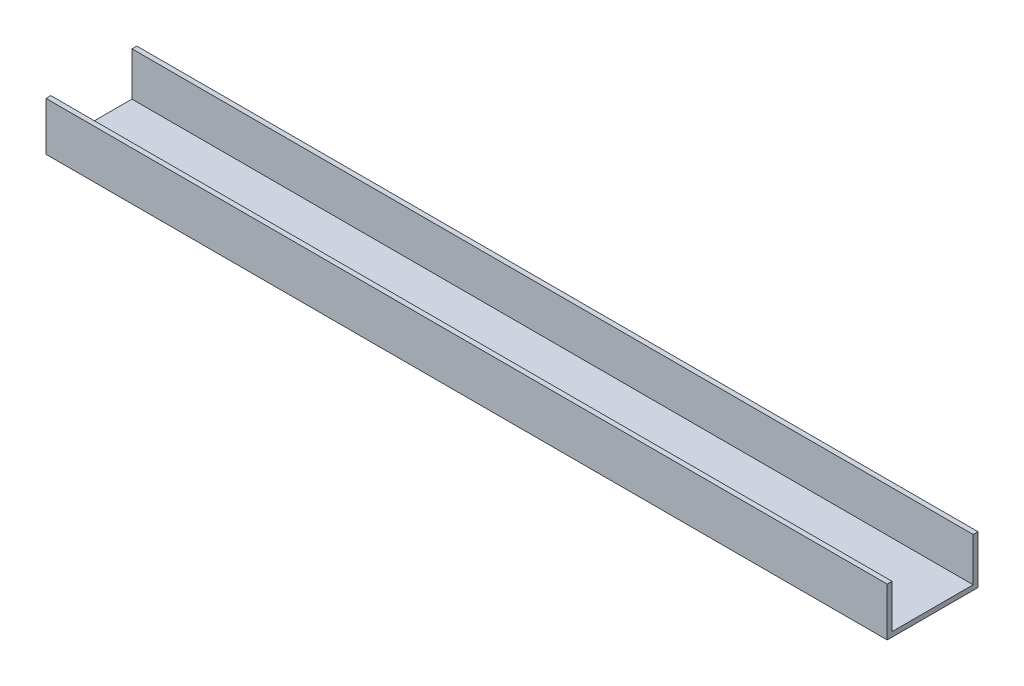
ISO-10303-21;
HEADER;
FILE_DESCRIPTION(('STEP AP214'),'2;1');
FILE_NAME('part.step','',(''),(''),'','','');
FILE_SCHEMA(('AUTOMOTIVE_DESIGN { 1 0 10303 214 1 1 1 1 }'));
ENDSEC;
DATA;
#1=APPLICATION_CONTEXT('core data for automotive mechanical design processes');
#2=APPLICATION_PROTOCOL_DEFINITION('international standard','automotive_design',2000,#1);
#3=PRODUCT_CONTEXT('',#1,'mechanical');
#4=PRODUCT('Part','Part','',(#3));
#5=PRODUCT_RELATED_PRODUCT_CATEGORY('part','',(#4));
#6=PRODUCT_DEFINITION_FORMATION('','',#4);
#7=PRODUCT_DEFINITION_CONTEXT('part definition',#1,'design');
#8=PRODUCT_DEFINITION('design','',#6,#7);
#9=PRODUCT_DEFINITION_SHAPE('','',#8);
#10=(LENGTH_UNIT() NAMED_UNIT(*) SI_UNIT(.MILLI.,.METRE.));
#11=(NAMED_UNIT(*) PLANE_ANGLE_UNIT() SI_UNIT($,.RADIAN.));
#12=(NAMED_UNIT(*) SI_UNIT($,.STERADIAN.) SOLID_ANGLE_UNIT());
#13=UNCERTAINTY_MEASURE_WITH_UNIT(LENGTH_MEASURE(1.E-05),#10,'distance_accuracy_value','');
#14=(GEOMETRIC_REPRESENTATION_CONTEXT(3) GLOBAL_UNCERTAINTY_ASSIGNED_CONTEXT((#13)) GLOBAL_UNIT_ASSIGNED_CONTEXT((#10,
#11,#12)) REPRESENTATION_CONTEXT('',''));
#15=CARTESIAN_POINT('',(0.,0.,0.));
#16=DIRECTION('',(0.,0.,1.));
#17=DIRECTION('',(1.,0.,0.));
#18=AXIS2_PLACEMENT_3D('',#15,#16,#17);
#19=CARTESIAN_POINT('',(0.,4.,0.));
#20=DIRECTION('',(0.,-1.,0.));
#21=DIRECTION('',(0.,0.,-1.));
#22=AXIS2_PLACEMENT_3D('',#19,#20,#21);
#23=PLANE('',#22);
#24=DIRECTION('',(1.,0.,0.));
#25=VECTOR('',#24,1.);
#26=CARTESIAN_POINT('',(695.,4.,-71.));
#27=LINE('',#26,#25);
#28=CARTESIAN_POINT('',(0.,4.,-70.9999999999999));
#29=VERTEX_POINT('',#28);
#30=CARTESIAN_POINT('',(695.,4.,-70.9999999999999));
#31=VERTEX_POINT('',#30);
#32=EDGE_CURVE('E61',#29,#31,#27,.T.);
#33=ORIENTED_EDGE('',*,*,#32,.F.);
#34=DIRECTION('',(0.,0.,1.));
#35=VECTOR('',#34,1.);
#36=CARTESIAN_POINT('',(0.,4.,0.));
#37=LINE('',#36,#35);
#38=CARTESIAN_POINT('',(0.,4.,-4.));
#39=VERTEX_POINT('',#38);
#40=EDGE_CURVE('E169',#29,#39,#37,.T.);
#41=ORIENTED_EDGE('',*,*,#40,.T.);
#42=DIRECTION('',(-1.,0.,0.));
#43=VECTOR('',#42,1.);
#44=CARTESIAN_POINT('',(0.,4.,-4.));
#45=LINE('',#44,#43);
#46=CARTESIAN_POINT('',(695.,4.,-4.));
#47=VERTEX_POINT('',#46);
#48=EDGE_CURVE('E138',#47,#39,#45,.T.);
#49=ORIENTED_EDGE('',*,*,#48,.F.);
#50=DIRECTION('',(0.,0.,-1.));
#51=VECTOR('',#50,1.);
#52=CARTESIAN_POINT('',(695.,4.,0.));
#53=LINE('',#52,#51);
#54=EDGE_CURVE('E66',#47,#31,#53,.T.);
#55=ORIENTED_EDGE('',*,*,#54,.T.);
#56=EDGE_LOOP('',(#33,#41,#49,#55));
#57=FACE_BOUND('',#56,.T.);
#58=ADVANCED_FACE('F45',(#57),#23,.F.);
#59=CARTESIAN_POINT('',(0.,4.,0.));
#60=DIRECTION('',(1.,0.,0.));
#61=DIRECTION('',(0.,0.,-1.));
#62=AXIS2_PLACEMENT_3D('',#59,#60,#61);
#63=PLANE('',#62);
#64=DIRECTION('',(0.,0.,1.));
#65=VECTOR('',#64,1.);
#66=CARTESIAN_POINT('',(0.,0.,0.));
#67=LINE('',#66,#65);
#68=CARTESIAN_POINT('',(0.,0.,-75.));
#69=VERTEX_POINT('',#68);
#70=CARTESIAN_POINT('',(0.,0.,0.));
#71=VERTEX_POINT('',#70);
#72=EDGE_CURVE('E168',#69,#71,#67,.T.);
#73=ORIENTED_EDGE('',*,*,#72,.T.);
#74=DIRECTION('',(0.,-1.,0.));
#75=VECTOR('',#74,1.);
#76=CARTESIAN_POINT('',(0.,4.,0.));
#77=LINE('',#76,#75);
#78=CARTESIAN_POINT('',(0.,40.,0.));
#79=VERTEX_POINT('',#78);
#80=EDGE_CURVE('E11',#79,#71,#77,.T.);
#81=ORIENTED_EDGE('',*,*,#80,.F.);
#82=DIRECTION('',(0.,0.,1.));
#83=VECTOR('',#82,1.);
#84=CARTESIAN_POINT('',(0.,40.,0.));
#85=LINE('',#84,#83);
#86=CARTESIAN_POINT('',(0.,40.,-4.));
#87=VERTEX_POINT('',#86);
#88=EDGE_CURVE('E143',#87,#79,#85,.T.);
#89=ORIENTED_EDGE('',*,*,#88,.F.);
#90=DIRECTION('',(0.,-1.,0.));
#91=VECTOR('',#90,1.);
#92=CARTESIAN_POINT('',(0.,40.,-4.));
#93=LINE('',#92,#91);
#94=EDGE_CURVE('E157',#87,#39,#93,.T.);
#95=ORIENTED_EDGE('',*,*,#94,.T.);
#96=ORIENTED_EDGE('',*,*,#40,.F.);
#97=DIRECTION('',(0.,-1.,0.));
#98=VECTOR('',#97,1.);
#99=CARTESIAN_POINT('',(0.,40.,-70.9999999999999));
#100=LINE('',#99,#98);
#101=CARTESIAN_POINT('',(0.,40.,-70.9999999999999));
#102=VERTEX_POINT('',#101);
#103=EDGE_CURVE('E127',#102,#29,#100,.T.);
#104=ORIENTED_EDGE('',*,*,#103,.F.);
#105=DIRECTION('',(0.,0.,1.));
#106=VECTOR('',#105,1.);
#107=CARTESIAN_POINT('',(0.,40.,-74.9999999999999));
#108=LINE('',#107,#106);
#109=CARTESIAN_POINT('',(0.,40.,-74.9999999999999));
#110=VERTEX_POINT('',#109);
#111=EDGE_CURVE('E116',#110,#102,#108,.T.);
#112=ORIENTED_EDGE('',*,*,#111,.F.);
#113=DIRECTION('',(0.,-1.,0.));
#114=VECTOR('',#113,1.);
#115=CARTESIAN_POINT('',(0.,4.,-75.));
#116=LINE('',#115,#114);
#117=EDGE_CURVE('E175',#110,#69,#116,.T.);
#118=ORIENTED_EDGE('',*,*,#117,.T.);
#119=EDGE_LOOP('',(#73,#81,#89,#95,#96,#104,#112,#118));
#120=FACE_BOUND('',#119,.T.);
#121=ADVANCED_FACE('F47',(#120),#63,.F.);
#122=CARTESIAN_POINT('',(0.,4.,0.));
#123=DIRECTION('',(0.,0.,-1.));
#124=DIRECTION('',(-1.,0.,0.));
#125=AXIS2_PLACEMENT_3D('',#122,#123,#124);
#126=PLANE('',#125);
#127=DIRECTION('',(1.,0.,0.));
#128=VECTOR('',#127,1.);
#129=CARTESIAN_POINT('',(0.,0.,0.));
#130=LINE('',#129,#128);
#131=CARTESIAN_POINT('',(695.,0.,0.));
#132=VERTEX_POINT('',#131);
#133=EDGE_CURVE('E179',#71,#132,#130,.T.);
#134=ORIENTED_EDGE('',*,*,#133,.T.);
#135=DIRECTION('',(0.,-1.,0.));
#136=VECTOR('',#135,1.);
#137=CARTESIAN_POINT('',(695.,4.,0.));
#138=LINE('',#137,#136);
#139=CARTESIAN_POINT('',(695.,40.,0.));
#140=VERTEX_POINT('',#139);
#141=EDGE_CURVE('E54',#140,#132,#138,.T.);
#142=ORIENTED_EDGE('',*,*,#141,.F.);
#143=DIRECTION('',(1.,0.,0.));
#144=VECTOR('',#143,1.);
#145=CARTESIAN_POINT('',(0.,40.,0.));
#146=LINE('',#145,#144);
#147=EDGE_CURVE('E147',#79,#140,#146,.T.);
#148=ORIENTED_EDGE('',*,*,#147,.F.);
#149=ORIENTED_EDGE('',*,*,#80,.T.);
#150=EDGE_LOOP('',(#134,#142,#148,#149));
#151=FACE_BOUND('',#150,.T.);
#152=ADVANCED_FACE('F215',(#151),#126,.F.);
#153=CARTESIAN_POINT('',(695.,4.,0.));
#154=DIRECTION('',(-1.,0.,0.));
#155=DIRECTION('',(0.,0.,1.));
#156=AXIS2_PLACEMENT_3D('',#153,#154,#155);
#157=PLANE('',#156);
#158=DIRECTION('',(0.,0.,-1.));
#159=VECTOR('',#158,1.);
#160=CARTESIAN_POINT('',(695.,0.,0.));
#161=LINE('',#160,#159);
#162=CARTESIAN_POINT('',(695.,0.,-75.));
#163=VERTEX_POINT('',#162);
#164=EDGE_CURVE('E182',#132,#163,#161,.T.);
#165=ORIENTED_EDGE('',*,*,#164,.T.);
#166=DIRECTION('',(0.,-1.,0.));
#167=VECTOR('',#166,1.);
#168=CARTESIAN_POINT('',(695.,4.,-75.));
#169=LINE('',#168,#167);
#170=CARTESIAN_POINT('',(695.,40.,-75.));
#171=VERTEX_POINT('',#170);
#172=EDGE_CURVE('E131',#171,#163,#169,.T.);
#173=ORIENTED_EDGE('',*,*,#172,.F.);
#174=DIRECTION('',(0.,0.,-1.));
#175=VECTOR('',#174,1.);
#176=CARTESIAN_POINT('',(695.,40.,-75.));
#177=LINE('',#176,#175);
#178=CARTESIAN_POINT('',(695.,40.,-71.));
#179=VERTEX_POINT('',#178);
#180=EDGE_CURVE('E114',#179,#171,#177,.T.);
#181=ORIENTED_EDGE('',*,*,#180,.F.);
#182=DIRECTION('',(0.,-1.,0.));
#183=VECTOR('',#182,1.);
#184=CARTESIAN_POINT('',(695.,40.,-71.));
#185=LINE('',#184,#183);
#186=EDGE_CURVE('E121',#179,#31,#185,.T.);
#187=ORIENTED_EDGE('',*,*,#186,.T.);
#188=ORIENTED_EDGE('',*,*,#54,.F.);
#189=DIRECTION('',(0.,-1.,0.));
#190=VECTOR('',#189,1.);
#191=CARTESIAN_POINT('',(695.,40.,-4.));
#192=LINE('',#191,#190);
#193=CARTESIAN_POINT('',(695.,40.,-4.));
#194=VERTEX_POINT('',#193);
#195=EDGE_CURVE('E164',#194,#47,#192,.T.);
#196=ORIENTED_EDGE('',*,*,#195,.F.);
#197=DIRECTION('',(0.,0.,-1.));
#198=VECTOR('',#197,1.);
#199=CARTESIAN_POINT('',(695.,40.,0.));
#200=LINE('',#199,#198);
#201=EDGE_CURVE('E151',#140,#194,#200,.T.);
#202=ORIENTED_EDGE('',*,*,#201,.F.);
#203=ORIENTED_EDGE('',*,*,#141,.T.);
#204=EDGE_LOOP('',(#165,#173,#181,#187,#188,#196,#202,#203));
#205=FACE_BOUND('',#204,.T.);
#206=ADVANCED_FACE('F129',(#205),#157,.F.);
#207=CARTESIAN_POINT('',(0.,4.,-75.));
#208=DIRECTION('',(0.,0.,1.));
#209=DIRECTION('',(1.,0.,0.));
#210=AXIS2_PLACEMENT_3D('',#207,#208,#209);
#211=PLANE('',#210);
#212=DIRECTION('',(-1.,0.,0.));
#213=VECTOR('',#212,1.);
#214=CARTESIAN_POINT('',(0.,0.,-75.));
#215=LINE('',#214,#213);
#216=EDGE_CURVE('E172',#163,#69,#215,.T.);
#217=ORIENTED_EDGE('',*,*,#216,.T.);
#218=ORIENTED_EDGE('',*,*,#117,.F.);
#219=DIRECTION('',(-1.,0.,0.));
#220=VECTOR('',#219,1.);
#221=CARTESIAN_POINT('',(695.,40.,-75.));
#222=LINE('',#221,#220);
#223=EDGE_CURVE('E134',#171,#110,#222,.T.);
#224=ORIENTED_EDGE('',*,*,#223,.F.);
#225=ORIENTED_EDGE('',*,*,#172,.T.);
#226=EDGE_LOOP('',(#217,#218,#224,#225));
#227=FACE_BOUND('',#226,.T.);
#228=ADVANCED_FACE('F203',(#227),#211,.F.);
#229=CARTESIAN_POINT('',(0.,0.,0.));
#230=DIRECTION('',(0.,-1.,0.));
#231=DIRECTION('',(0.,0.,-1.));
#232=AXIS2_PLACEMENT_3D('',#229,#230,#231);
#233=PLANE('',#232);
#234=ORIENTED_EDGE('',*,*,#72,.F.);
#235=ORIENTED_EDGE('',*,*,#216,.F.);
#236=ORIENTED_EDGE('',*,*,#164,.F.);
#237=ORIENTED_EDGE('',*,*,#133,.F.);
#238=EDGE_LOOP('',(#234,#235,#236,#237));
#239=FACE_BOUND('',#238,.T.);
#240=ADVANCED_FACE('F201',(#239),#233,.T.);
#241=CARTESIAN_POINT('',(0.,40.,-4.));
#242=DIRECTION('',(0.,0.,1.));
#243=DIRECTION('',(1.,0.,0.));
#244=AXIS2_PLACEMENT_3D('',#241,#242,#243);
#245=PLANE('',#244);
#246=ORIENTED_EDGE('',*,*,#48,.T.);
#247=ORIENTED_EDGE('',*,*,#94,.F.);
#248=DIRECTION('',(-1.,0.,0.));
#249=VECTOR('',#248,1.);
#250=CARTESIAN_POINT('',(0.,40.,-4.));
#251=LINE('',#250,#249);
#252=EDGE_CURVE('E154',#194,#87,#251,.T.);
#253=ORIENTED_EDGE('',*,*,#252,.F.);
#254=ORIENTED_EDGE('',*,*,#195,.T.);
#255=EDGE_LOOP('',(#246,#247,#253,#254));
#256=FACE_BOUND('',#255,.T.);
#257=ADVANCED_FACE('F211',(#256),#245,.F.);
#258=CARTESIAN_POINT('',(0.,40.,0.));
#259=DIRECTION('',(0.,-1.,0.));
#260=DIRECTION('',(0.,0.,-1.));
#261=AXIS2_PLACEMENT_3D('',#258,#259,#260);
#262=PLANE('',#261);
#263=ORIENTED_EDGE('',*,*,#88,.T.);
#264=ORIENTED_EDGE('',*,*,#147,.T.);
#265=ORIENTED_EDGE('',*,*,#201,.T.);
#266=ORIENTED_EDGE('',*,*,#252,.T.);
#267=EDGE_LOOP('',(#263,#264,#265,#266));
#268=FACE_BOUND('',#267,.T.);
#269=ADVANCED_FACE('F214',(#268),#262,.F.);
#270=CARTESIAN_POINT('',(695.,40.,-71.));
#271=DIRECTION('',(0.,0.,-1.));
#272=DIRECTION('',(-1.,0.,0.));
#273=AXIS2_PLACEMENT_3D('',#270,#271,#272);
#274=PLANE('',#273);
#275=ORIENTED_EDGE('',*,*,#32,.T.);
#276=ORIENTED_EDGE('',*,*,#186,.F.);
#277=DIRECTION('',(1.,0.,0.));
#278=VECTOR('',#277,1.);
#279=CARTESIAN_POINT('',(695.,40.,-71.));
#280=LINE('',#279,#278);
#281=EDGE_CURVE('E109',#102,#179,#280,.T.);
#282=ORIENTED_EDGE('',*,*,#281,.F.);
#283=ORIENTED_EDGE('',*,*,#103,.T.);
#284=EDGE_LOOP('',(#275,#276,#282,#283));
#285=FACE_BOUND('',#284,.T.);
#286=ADVANCED_FACE('F124',(#285),#274,.F.);
#287=CARTESIAN_POINT('',(0.,40.,0.));
#288=DIRECTION('',(0.,-1.,0.));
#289=DIRECTION('',(0.,0.,-1.));
#290=AXIS2_PLACEMENT_3D('',#287,#288,#289);
#291=PLANE('',#290);
#292=ORIENTED_EDGE('',*,*,#180,.T.);
#293=ORIENTED_EDGE('',*,*,#223,.T.);
#294=ORIENTED_EDGE('',*,*,#111,.T.);
#295=ORIENTED_EDGE('',*,*,#281,.T.);
#296=EDGE_LOOP('',(#292,#293,#294,#295));
#297=FACE_BOUND('',#296,.T.);
#298=ADVANCED_FACE('F111',(#297),#291,.F.);
#299=CLOSED_SHELL('',(#58,#121,#152,#206,#228,#240,#257,#269,#286,#298));
#300=MANIFOLD_SOLID_BREP('B2',#299);
#301=ADVANCED_BREP_SHAPE_REPRESENTATION('',(#18,#300),#14);
#302=SHAPE_DEFINITION_REPRESENTATION(#9,#301);
ENDSEC;
END-ISO-10303-21;
